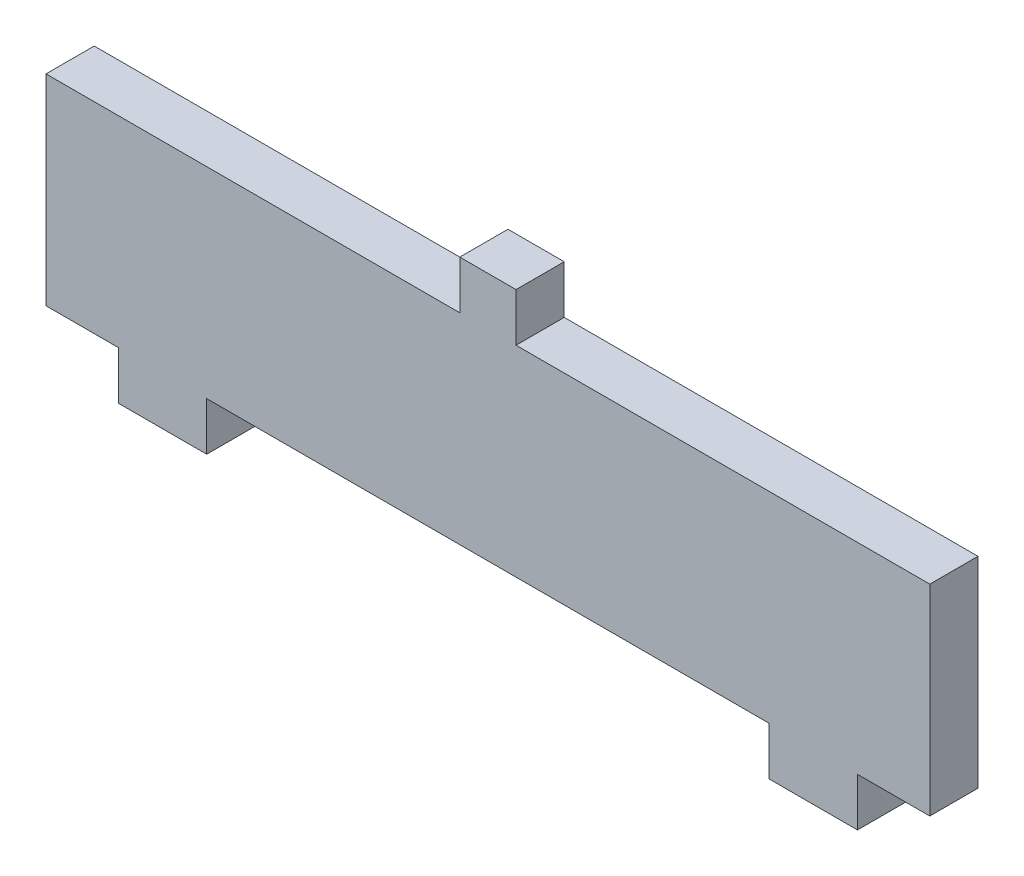
ISO-10303-21;
HEADER;
FILE_DESCRIPTION(('STEP AP214'),'2;1');
FILE_NAME('part.step','',(''),(''),'','','');
FILE_SCHEMA(('AUTOMOTIVE_DESIGN { 1 0 10303 214 1 1 1 1 }'));
ENDSEC;
DATA;
#1=APPLICATION_CONTEXT('core data for automotive mechanical design processes');
#2=APPLICATION_PROTOCOL_DEFINITION('international standard','automotive_design',2000,#1);
#3=PRODUCT_CONTEXT('',#1,'mechanical');
#4=PRODUCT('Part','Part','',(#3));
#5=PRODUCT_RELATED_PRODUCT_CATEGORY('part','',(#4));
#6=PRODUCT_DEFINITION_FORMATION('','',#4);
#7=PRODUCT_DEFINITION_CONTEXT('part definition',#1,'design');
#8=PRODUCT_DEFINITION('design','',#6,#7);
#9=PRODUCT_DEFINITION_SHAPE('','',#8);
#10=(LENGTH_UNIT() NAMED_UNIT(*) SI_UNIT(.MILLI.,.METRE.));
#11=(NAMED_UNIT(*) PLANE_ANGLE_UNIT() SI_UNIT($,.RADIAN.));
#12=(NAMED_UNIT(*) SI_UNIT($,.STERADIAN.) SOLID_ANGLE_UNIT());
#13=UNCERTAINTY_MEASURE_WITH_UNIT(LENGTH_MEASURE(1.E-05),#10,'distance_accuracy_value','');
#14=(GEOMETRIC_REPRESENTATION_CONTEXT(3) GLOBAL_UNCERTAINTY_ASSIGNED_CONTEXT((#13)) GLOBAL_UNIT_ASSIGNED_CONTEXT((#10,
#11,#12)) REPRESENTATION_CONTEXT('',''));
#15=CARTESIAN_POINT('',(0.,0.,0.));
#16=DIRECTION('',(0.,0.,1.));
#17=DIRECTION('',(1.,0.,0.));
#18=AXIS2_PLACEMENT_3D('',#15,#16,#17);
#19=CARTESIAN_POINT('',(27.5,-6.25,3.));
#20=DIRECTION('',(-1.,0.,0.));
#21=DIRECTION('',(0.,0.,1.));
#22=AXIS2_PLACEMENT_3D('',#19,#20,#21);
#23=PLANE('',#22);
#24=DIRECTION('',(0.,1.,0.));
#25=VECTOR('',#24,1.);
#26=CARTESIAN_POINT('',(27.5,-6.25,0.));
#27=LINE('',#26,#25);
#28=CARTESIAN_POINT('',(27.5,-6.25,0.));
#29=VERTEX_POINT('',#28);
#30=CARTESIAN_POINT('',(27.5,6.25,0.));
#31=VERTEX_POINT('',#30);
#32=EDGE_CURVE('E177',#29,#31,#27,.T.);
#33=ORIENTED_EDGE('',*,*,#32,.T.);
#34=DIRECTION('',(0.,0.,-1.));
#35=VECTOR('',#34,1.);
#36=CARTESIAN_POINT('',(27.5,6.25,3.));
#37=LINE('',#36,#35);
#38=CARTESIAN_POINT('',(27.5,6.25,3.));
#39=VERTEX_POINT('',#38);
#40=EDGE_CURVE('E11',#39,#31,#37,.T.);
#41=ORIENTED_EDGE('',*,*,#40,.F.);
#42=DIRECTION('',(0.,1.,0.));
#43=VECTOR('',#42,1.);
#44=CARTESIAN_POINT('',(27.5,-6.25,3.));
#45=LINE('',#44,#43);
#46=CARTESIAN_POINT('',(27.5,-6.25,3.));
#47=VERTEX_POINT('',#46);
#48=EDGE_CURVE('E207',#47,#39,#45,.T.);
#49=ORIENTED_EDGE('',*,*,#48,.F.);
#50=DIRECTION('',(0.,0.,-1.));
#51=VECTOR('',#50,1.);
#52=CARTESIAN_POINT('',(27.5,-6.25,3.));
#53=LINE('',#52,#51);
#54=EDGE_CURVE('E173',#47,#29,#53,.T.);
#55=ORIENTED_EDGE('',*,*,#54,.T.);
#56=EDGE_LOOP('',(#33,#41,#49,#55));
#57=FACE_BOUND('',#56,.T.);
#58=ADVANCED_FACE('F33',(#57),#23,.F.);
#59=CARTESIAN_POINT('',(1.75,6.25000000000001,3.));
#60=DIRECTION('',(0.,-1.,0.));
#61=DIRECTION('',(1.,0.,0.));
#62=AXIS2_PLACEMENT_3D('',#59,#60,#61);
#63=PLANE('',#62);
#64=DIRECTION('',(-1.,0.,0.));
#65=VECTOR('',#64,1.);
#66=CARTESIAN_POINT('',(1.75,6.25000000000001,0.));
#67=LINE('',#66,#65);
#68=CARTESIAN_POINT('',(1.75,6.25000000000001,0.));
#69=VERTEX_POINT('',#68);
#70=EDGE_CURVE('E180',#31,#69,#67,.T.);
#71=ORIENTED_EDGE('',*,*,#70,.T.);
#72=DIRECTION('',(0.,0.,-1.));
#73=VECTOR('',#72,1.);
#74=CARTESIAN_POINT('',(1.75,6.25000000000001,3.));
#75=LINE('',#74,#73);
#76=CARTESIAN_POINT('',(1.75,6.25000000000001,3.));
#77=VERTEX_POINT('',#76);
#78=EDGE_CURVE('E41',#77,#69,#75,.T.);
#79=ORIENTED_EDGE('',*,*,#78,.F.);
#80=DIRECTION('',(-1.,0.,0.));
#81=VECTOR('',#80,1.);
#82=CARTESIAN_POINT('',(1.75,6.25000000000001,3.));
#83=LINE('',#82,#81);
#84=EDGE_CURVE('E116',#39,#77,#83,.T.);
#85=ORIENTED_EDGE('',*,*,#84,.F.);
#86=ORIENTED_EDGE('',*,*,#40,.T.);
#87=EDGE_LOOP('',(#71,#79,#85,#86));
#88=FACE_BOUND('',#87,.T.);
#89=ADVANCED_FACE('F305',(#88),#63,.F.);
#90=CARTESIAN_POINT('',(1.75,6.25000000000001,3.));
#91=DIRECTION('',(-1.,0.,0.));
#92=DIRECTION('',(0.,-1.,0.));
#93=AXIS2_PLACEMENT_3D('',#90,#91,#92);
#94=PLANE('',#93);
#95=DIRECTION('',(0.,1.,0.));
#96=VECTOR('',#95,1.);
#97=CARTESIAN_POINT('',(1.75,6.25000000000001,0.));
#98=LINE('',#97,#96);
#99=CARTESIAN_POINT('',(1.75,9.25000000000001,0.));
#100=VERTEX_POINT('',#99);
#101=EDGE_CURVE('E182',#69,#100,#98,.T.);
#102=ORIENTED_EDGE('',*,*,#101,.T.);
#103=DIRECTION('',(0.,0.,-1.));
#104=VECTOR('',#103,1.);
#105=CARTESIAN_POINT('',(1.75,9.25000000000001,3.));
#106=LINE('',#105,#104);
#107=CARTESIAN_POINT('',(1.75,9.25000000000001,3.));
#108=VERTEX_POINT('',#107);
#109=EDGE_CURVE('E238',#108,#100,#106,.T.);
#110=ORIENTED_EDGE('',*,*,#109,.F.);
#111=DIRECTION('',(0.,1.,0.));
#112=VECTOR('',#111,1.);
#113=CARTESIAN_POINT('',(1.75,6.25000000000001,3.));
#114=LINE('',#113,#112);
#115=EDGE_CURVE('E246',#77,#108,#114,.T.);
#116=ORIENTED_EDGE('',*,*,#115,.F.);
#117=ORIENTED_EDGE('',*,*,#78,.T.);
#118=EDGE_LOOP('',(#102,#110,#116,#117));
#119=FACE_BOUND('',#118,.T.);
#120=ADVANCED_FACE('F244',(#119),#94,.F.);
#121=CARTESIAN_POINT('',(-1.75,9.25000000000001,3.));
#122=DIRECTION('',(0.,-1.,0.));
#123=DIRECTION('',(0.,0.,-1.));
#124=AXIS2_PLACEMENT_3D('',#121,#122,#123);
#125=PLANE('',#124);
#126=DIRECTION('',(-1.,0.,0.));
#127=VECTOR('',#126,1.);
#128=CARTESIAN_POINT('',(-1.75,9.25000000000001,0.));
#129=LINE('',#128,#127);
#130=CARTESIAN_POINT('',(-1.75,9.25000000000001,0.));
#131=VERTEX_POINT('',#130);
#132=EDGE_CURVE('E184',#100,#131,#129,.T.);
#133=ORIENTED_EDGE('',*,*,#132,.T.);
#134=DIRECTION('',(0.,0.,-1.));
#135=VECTOR('',#134,1.);
#136=CARTESIAN_POINT('',(-1.75,9.25000000000001,3.));
#137=LINE('',#136,#135);
#138=CARTESIAN_POINT('',(-1.75,9.25000000000001,3.));
#139=VERTEX_POINT('',#138);
#140=EDGE_CURVE('E235',#139,#131,#137,.T.);
#141=ORIENTED_EDGE('',*,*,#140,.F.);
#142=DIRECTION('',(-1.,0.,0.));
#143=VECTOR('',#142,1.);
#144=CARTESIAN_POINT('',(-1.75,9.25000000000001,3.));
#145=LINE('',#144,#143);
#146=EDGE_CURVE('E264',#108,#139,#145,.T.);
#147=ORIENTED_EDGE('',*,*,#146,.F.);
#148=ORIENTED_EDGE('',*,*,#109,.T.);
#149=EDGE_LOOP('',(#133,#141,#147,#148));
#150=FACE_BOUND('',#149,.T.);
#151=ADVANCED_FACE('F255',(#150),#125,.F.);
#152=CARTESIAN_POINT('',(-1.75,6.25000000000001,3.));
#153=DIRECTION('',(1.,0.,0.));
#154=DIRECTION('',(0.,1.,0.));
#155=AXIS2_PLACEMENT_3D('',#152,#153,#154);
#156=PLANE('',#155);
#157=DIRECTION('',(0.,-1.,0.));
#158=VECTOR('',#157,1.);
#159=CARTESIAN_POINT('',(-1.75,6.25000000000001,0.));
#160=LINE('',#159,#158);
#161=CARTESIAN_POINT('',(-1.75,6.25000000000001,0.));
#162=VERTEX_POINT('',#161);
#163=EDGE_CURVE('E186',#131,#162,#160,.T.);
#164=ORIENTED_EDGE('',*,*,#163,.T.);
#165=DIRECTION('',(0.,0.,-1.));
#166=VECTOR('',#165,1.);
#167=CARTESIAN_POINT('',(-1.75,6.25000000000001,3.));
#168=LINE('',#167,#166);
#169=CARTESIAN_POINT('',(-1.75,6.25000000000001,3.));
#170=VERTEX_POINT('',#169);
#171=EDGE_CURVE('E232',#170,#162,#168,.T.);
#172=ORIENTED_EDGE('',*,*,#171,.F.);
#173=DIRECTION('',(0.,-1.,0.));
#174=VECTOR('',#173,1.);
#175=CARTESIAN_POINT('',(-1.75,6.25000000000001,3.));
#176=LINE('',#175,#174);
#177=EDGE_CURVE('E261',#139,#170,#176,.T.);
#178=ORIENTED_EDGE('',*,*,#177,.F.);
#179=ORIENTED_EDGE('',*,*,#140,.T.);
#180=EDGE_LOOP('',(#164,#172,#178,#179));
#181=FACE_BOUND('',#180,.T.);
#182=ADVANCED_FACE('F259',(#181),#156,.F.);
#183=CARTESIAN_POINT('',(-27.5,6.25,3.));
#184=DIRECTION('',(0.,-1.,0.));
#185=DIRECTION('',(1.,0.,0.));
#186=AXIS2_PLACEMENT_3D('',#183,#184,#185);
#187=PLANE('',#186);
#188=DIRECTION('',(-1.,0.,0.));
#189=VECTOR('',#188,1.);
#190=CARTESIAN_POINT('',(-27.5,6.25,0.));
#191=LINE('',#190,#189);
#192=CARTESIAN_POINT('',(-27.5,6.25,0.));
#193=VERTEX_POINT('',#192);
#194=EDGE_CURVE('E188',#162,#193,#191,.T.);
#195=ORIENTED_EDGE('',*,*,#194,.T.);
#196=DIRECTION('',(0.,0.,-1.));
#197=VECTOR('',#196,1.);
#198=CARTESIAN_POINT('',(-27.5,6.25,3.));
#199=LINE('',#198,#197);
#200=CARTESIAN_POINT('',(-27.5,6.25,3.));
#201=VERTEX_POINT('',#200);
#202=EDGE_CURVE('E229',#201,#193,#199,.T.);
#203=ORIENTED_EDGE('',*,*,#202,.F.);
#204=DIRECTION('',(-1.,0.,0.));
#205=VECTOR('',#204,1.);
#206=CARTESIAN_POINT('',(-27.5,6.25,3.));
#207=LINE('',#206,#205);
#208=EDGE_CURVE('E263',#170,#201,#207,.T.);
#209=ORIENTED_EDGE('',*,*,#208,.F.);
#210=ORIENTED_EDGE('',*,*,#171,.T.);
#211=EDGE_LOOP('',(#195,#203,#209,#210));
#212=FACE_BOUND('',#211,.T.);
#213=ADVANCED_FACE('F318',(#212),#187,.F.);
#214=CARTESIAN_POINT('',(-27.5,-6.25,3.));
#215=DIRECTION('',(1.,0.,0.));
#216=DIRECTION('',(0.,0.,-1.));
#217=AXIS2_PLACEMENT_3D('',#214,#215,#216);
#218=PLANE('',#217);
#219=DIRECTION('',(0.,-1.,0.));
#220=VECTOR('',#219,1.);
#221=CARTESIAN_POINT('',(-27.5,-6.25,0.));
#222=LINE('',#221,#220);
#223=CARTESIAN_POINT('',(-27.5,-6.25,0.));
#224=VERTEX_POINT('',#223);
#225=EDGE_CURVE('E190',#193,#224,#222,.T.);
#226=ORIENTED_EDGE('',*,*,#225,.T.);
#227=DIRECTION('',(0.,0.,-1.));
#228=VECTOR('',#227,1.);
#229=CARTESIAN_POINT('',(-27.5,-6.25,3.));
#230=LINE('',#229,#228);
#231=CARTESIAN_POINT('',(-27.5,-6.25,3.));
#232=VERTEX_POINT('',#231);
#233=EDGE_CURVE('E226',#232,#224,#230,.T.);
#234=ORIENTED_EDGE('',*,*,#233,.F.);
#235=DIRECTION('',(0.,-1.,0.));
#236=VECTOR('',#235,1.);
#237=CARTESIAN_POINT('',(-27.5,-6.25,3.));
#238=LINE('',#237,#236);
#239=EDGE_CURVE('E266',#201,#232,#238,.T.);
#240=ORIENTED_EDGE('',*,*,#239,.F.);
#241=ORIENTED_EDGE('',*,*,#202,.T.);
#242=EDGE_LOOP('',(#226,#234,#240,#241));
#243=FACE_BOUND('',#242,.T.);
#244=ADVANCED_FACE('F321',(#243),#218,.F.);
#245=CARTESIAN_POINT('',(-27.5,-6.25,3.));
#246=DIRECTION('',(0.,1.,0.));
#247=DIRECTION('',(0.,0.,1.));
#248=AXIS2_PLACEMENT_3D('',#245,#246,#247);
#249=PLANE('',#248);
#250=DIRECTION('',(1.,0.,0.));
#251=VECTOR('',#250,1.);
#252=CARTESIAN_POINT('',(-27.5,-6.25,0.));
#253=LINE('',#252,#251);
#254=CARTESIAN_POINT('',(-23.,-6.25,0.));
#255=VERTEX_POINT('',#254);
#256=EDGE_CURVE('E192',#224,#255,#253,.T.);
#257=ORIENTED_EDGE('',*,*,#256,.T.);
#258=DIRECTION('',(0.,0.,-1.));
#259=VECTOR('',#258,1.);
#260=CARTESIAN_POINT('',(-23.,-6.25,3.));
#261=LINE('',#260,#259);
#262=CARTESIAN_POINT('',(-23.,-6.25,3.));
#263=VERTEX_POINT('',#262);
#264=EDGE_CURVE('E223',#263,#255,#261,.T.);
#265=ORIENTED_EDGE('',*,*,#264,.F.);
#266=DIRECTION('',(1.,0.,0.));
#267=VECTOR('',#266,1.);
#268=CARTESIAN_POINT('',(-27.5,-6.25,3.));
#269=LINE('',#268,#267);
#270=EDGE_CURVE('E272',#232,#263,#269,.T.);
#271=ORIENTED_EDGE('',*,*,#270,.F.);
#272=ORIENTED_EDGE('',*,*,#233,.T.);
#273=EDGE_LOOP('',(#257,#265,#271,#272));
#274=FACE_BOUND('',#273,.T.);
#275=ADVANCED_FACE('F325',(#274),#249,.F.);
#276=CARTESIAN_POINT('',(-23.,-6.25,3.));
#277=DIRECTION('',(1.,0.,0.));
#278=DIRECTION('',(0.,1.,0.));
#279=AXIS2_PLACEMENT_3D('',#276,#277,#278);
#280=PLANE('',#279);
#281=DIRECTION('',(0.,-1.,0.));
#282=VECTOR('',#281,1.);
#283=CARTESIAN_POINT('',(-23.,-6.25,0.));
#284=LINE('',#283,#282);
#285=CARTESIAN_POINT('',(-23.,-9.25,0.));
#286=VERTEX_POINT('',#285);
#287=EDGE_CURVE('E194',#255,#286,#284,.T.);
#288=ORIENTED_EDGE('',*,*,#287,.T.);
#289=DIRECTION('',(0.,0.,-1.));
#290=VECTOR('',#289,1.);
#291=CARTESIAN_POINT('',(-23.,-9.25,3.));
#292=LINE('',#291,#290);
#293=CARTESIAN_POINT('',(-23.,-9.25,3.));
#294=VERTEX_POINT('',#293);
#295=EDGE_CURVE('E220',#294,#286,#292,.T.);
#296=ORIENTED_EDGE('',*,*,#295,.F.);
#297=DIRECTION('',(0.,-1.,0.));
#298=VECTOR('',#297,1.);
#299=CARTESIAN_POINT('',(-23.,-6.25,3.));
#300=LINE('',#299,#298);
#301=EDGE_CURVE('E274',#263,#294,#300,.T.);
#302=ORIENTED_EDGE('',*,*,#301,.F.);
#303=ORIENTED_EDGE('',*,*,#264,.T.);
#304=EDGE_LOOP('',(#288,#296,#302,#303));
#305=FACE_BOUND('',#304,.T.);
#306=ADVANCED_FACE('F329',(#305),#280,.F.);
#307=CARTESIAN_POINT('',(-23.,-9.25,3.));
#308=DIRECTION('',(0.,1.,0.));
#309=DIRECTION('',(0.,0.,1.));
#310=AXIS2_PLACEMENT_3D('',#307,#308,#309);
#311=PLANE('',#310);
#312=DIRECTION('',(1.,0.,0.));
#313=VECTOR('',#312,1.);
#314=CARTESIAN_POINT('',(-23.,-9.25,0.));
#315=LINE('',#314,#313);
#316=CARTESIAN_POINT('',(-17.5,-9.25,0.));
#317=VERTEX_POINT('',#316);
#318=EDGE_CURVE('E196',#286,#317,#315,.T.);
#319=ORIENTED_EDGE('',*,*,#318,.T.);
#320=DIRECTION('',(0.,0.,-1.));
#321=VECTOR('',#320,1.);
#322=CARTESIAN_POINT('',(-17.5,-9.25,3.));
#323=LINE('',#322,#321);
#324=CARTESIAN_POINT('',(-17.5,-9.25,3.));
#325=VERTEX_POINT('',#324);
#326=EDGE_CURVE('E217',#325,#317,#323,.T.);
#327=ORIENTED_EDGE('',*,*,#326,.F.);
#328=DIRECTION('',(1.,0.,0.));
#329=VECTOR('',#328,1.);
#330=CARTESIAN_POINT('',(-23.,-9.25,3.));
#331=LINE('',#330,#329);
#332=EDGE_CURVE('E276',#294,#325,#331,.T.);
#333=ORIENTED_EDGE('',*,*,#332,.F.);
#334=ORIENTED_EDGE('',*,*,#295,.T.);
#335=EDGE_LOOP('',(#319,#327,#333,#334));
#336=FACE_BOUND('',#335,.T.);
#337=ADVANCED_FACE('F333',(#336),#311,.F.);
#338=CARTESIAN_POINT('',(-17.5,-6.25,3.));
#339=DIRECTION('',(-1.,0.,0.));
#340=DIRECTION('',(0.,0.,1.));
#341=AXIS2_PLACEMENT_3D('',#338,#339,#340);
#342=PLANE('',#341);
#343=DIRECTION('',(0.,1.,0.));
#344=VECTOR('',#343,1.);
#345=CARTESIAN_POINT('',(-17.5,-6.25,0.));
#346=LINE('',#345,#344);
#347=CARTESIAN_POINT('',(-17.5,-6.25,0.));
#348=VERTEX_POINT('',#347);
#349=EDGE_CURVE('E198',#317,#348,#346,.T.);
#350=ORIENTED_EDGE('',*,*,#349,.T.);
#351=DIRECTION('',(0.,0.,-1.));
#352=VECTOR('',#351,1.);
#353=CARTESIAN_POINT('',(-17.5,-6.25,3.));
#354=LINE('',#353,#352);
#355=CARTESIAN_POINT('',(-17.5,-6.25,3.));
#356=VERTEX_POINT('',#355);
#357=EDGE_CURVE('E214',#356,#348,#354,.T.);
#358=ORIENTED_EDGE('',*,*,#357,.F.);
#359=DIRECTION('',(0.,1.,0.));
#360=VECTOR('',#359,1.);
#361=CARTESIAN_POINT('',(-17.5,-6.25,3.));
#362=LINE('',#361,#360);
#363=EDGE_CURVE('E278',#325,#356,#362,.T.);
#364=ORIENTED_EDGE('',*,*,#363,.F.);
#365=ORIENTED_EDGE('',*,*,#326,.T.);
#366=EDGE_LOOP('',(#350,#358,#364,#365));
#367=FACE_BOUND('',#366,.T.);
#368=ADVANCED_FACE('F337',(#367),#342,.F.);
#369=CARTESIAN_POINT('',(-17.5,-6.25,3.));
#370=DIRECTION('',(0.,1.,0.));
#371=DIRECTION('',(0.,0.,1.));
#372=AXIS2_PLACEMENT_3D('',#369,#370,#371);
#373=PLANE('',#372);
#374=DIRECTION('',(1.,0.,0.));
#375=VECTOR('',#374,1.);
#376=CARTESIAN_POINT('',(-17.5,-6.25,0.));
#377=LINE('',#376,#375);
#378=CARTESIAN_POINT('',(17.5,-6.25,0.));
#379=VERTEX_POINT('',#378);
#380=EDGE_CURVE('E200',#348,#379,#377,.T.);
#381=ORIENTED_EDGE('',*,*,#380,.T.);
#382=DIRECTION('',(0.,0.,-1.));
#383=VECTOR('',#382,1.);
#384=CARTESIAN_POINT('',(17.5,-6.25,3.));
#385=LINE('',#384,#383);
#386=CARTESIAN_POINT('',(17.5,-6.25,3.));
#387=VERTEX_POINT('',#386);
#388=EDGE_CURVE('E211',#387,#379,#385,.T.);
#389=ORIENTED_EDGE('',*,*,#388,.F.);
#390=DIRECTION('',(1.,0.,0.));
#391=VECTOR('',#390,1.);
#392=CARTESIAN_POINT('',(-17.5,-6.25,3.));
#393=LINE('',#392,#391);
#394=EDGE_CURVE('E280',#356,#387,#393,.T.);
#395=ORIENTED_EDGE('',*,*,#394,.F.);
#396=ORIENTED_EDGE('',*,*,#357,.T.);
#397=EDGE_LOOP('',(#381,#389,#395,#396));
#398=FACE_BOUND('',#397,.T.);
#399=ADVANCED_FACE('F286',(#398),#373,.F.);
#400=CARTESIAN_POINT('',(17.5,-6.25,3.));
#401=DIRECTION('',(1.,0.,0.));
#402=DIRECTION('',(0.,0.,-1.));
#403=AXIS2_PLACEMENT_3D('',#400,#401,#402);
#404=PLANE('',#403);
#405=DIRECTION('',(0.,-1.,0.));
#406=VECTOR('',#405,1.);
#407=CARTESIAN_POINT('',(17.5,-6.25,0.));
#408=LINE('',#407,#406);
#409=CARTESIAN_POINT('',(17.5,-9.25,0.));
#410=VERTEX_POINT('',#409);
#411=EDGE_CURVE('E202',#379,#410,#408,.T.);
#412=ORIENTED_EDGE('',*,*,#411,.T.);
#413=DIRECTION('',(0.,0.,-1.));
#414=VECTOR('',#413,1.);
#415=CARTESIAN_POINT('',(17.5,-9.25,3.));
#416=LINE('',#415,#414);
#417=CARTESIAN_POINT('',(17.5,-9.25,3.));
#418=VERTEX_POINT('',#417);
#419=EDGE_CURVE('E168',#418,#410,#416,.T.);
#420=ORIENTED_EDGE('',*,*,#419,.F.);
#421=DIRECTION('',(0.,-1.,0.));
#422=VECTOR('',#421,1.);
#423=CARTESIAN_POINT('',(17.5,-6.25,3.));
#424=LINE('',#423,#422);
#425=EDGE_CURVE('E159',#387,#418,#424,.T.);
#426=ORIENTED_EDGE('',*,*,#425,.F.);
#427=ORIENTED_EDGE('',*,*,#388,.T.);
#428=EDGE_LOOP('',(#412,#420,#426,#427));
#429=FACE_BOUND('',#428,.T.);
#430=ADVANCED_FACE('F290',(#429),#404,.F.);
#431=CARTESIAN_POINT('',(17.5,-9.25,3.));
#432=DIRECTION('',(0.,1.,0.));
#433=DIRECTION('',(-1.,0.,0.));
#434=AXIS2_PLACEMENT_3D('',#431,#432,#433);
#435=PLANE('',#434);
#436=DIRECTION('',(1.,0.,0.));
#437=VECTOR('',#436,1.);
#438=CARTESIAN_POINT('',(17.5,-9.25,0.));
#439=LINE('',#438,#437);
#440=CARTESIAN_POINT('',(23.,-9.25,0.));
#441=VERTEX_POINT('',#440);
#442=EDGE_CURVE('E167',#410,#441,#439,.T.);
#443=ORIENTED_EDGE('',*,*,#442,.T.);
#444=DIRECTION('',(0.,0.,-1.));
#445=VECTOR('',#444,1.);
#446=CARTESIAN_POINT('',(23.,-9.25,3.));
#447=LINE('',#446,#445);
#448=CARTESIAN_POINT('',(23.,-9.25,3.));
#449=VERTEX_POINT('',#448);
#450=EDGE_CURVE('E164',#449,#441,#447,.T.);
#451=ORIENTED_EDGE('',*,*,#450,.F.);
#452=DIRECTION('',(1.,0.,0.));
#453=VECTOR('',#452,1.);
#454=CARTESIAN_POINT('',(17.5,-9.25,3.));
#455=LINE('',#454,#453);
#456=EDGE_CURVE('E153',#418,#449,#455,.T.);
#457=ORIENTED_EDGE('',*,*,#456,.F.);
#458=ORIENTED_EDGE('',*,*,#419,.T.);
#459=EDGE_LOOP('',(#443,#451,#457,#458));
#460=FACE_BOUND('',#459,.T.);
#461=ADVANCED_FACE('F165',(#460),#435,.F.);
#462=CARTESIAN_POINT('',(23.,-6.25,3.));
#463=DIRECTION('',(-1.,0.,0.));
#464=DIRECTION('',(0.,0.,1.));
#465=AXIS2_PLACEMENT_3D('',#462,#463,#464);
#466=PLANE('',#465);
#467=DIRECTION('',(0.,1.,0.));
#468=VECTOR('',#467,1.);
#469=CARTESIAN_POINT('',(23.,-6.25,0.));
#470=LINE('',#469,#468);
#471=CARTESIAN_POINT('',(23.,-6.25,0.));
#472=VERTEX_POINT('',#471);
#473=EDGE_CURVE('E102',#441,#472,#470,.T.);
#474=ORIENTED_EDGE('',*,*,#473,.T.);
#475=DIRECTION('',(0.,0.,-1.));
#476=VECTOR('',#475,1.);
#477=CARTESIAN_POINT('',(23.,-6.25,3.));
#478=LINE('',#477,#476);
#479=CARTESIAN_POINT('',(23.,-6.25,3.));
#480=VERTEX_POINT('',#479);
#481=EDGE_CURVE('E169',#480,#472,#478,.T.);
#482=ORIENTED_EDGE('',*,*,#481,.F.);
#483=DIRECTION('',(0.,1.,0.));
#484=VECTOR('',#483,1.);
#485=CARTESIAN_POINT('',(23.,-6.25,3.));
#486=LINE('',#485,#484);
#487=EDGE_CURVE('E157',#449,#480,#486,.T.);
#488=ORIENTED_EDGE('',*,*,#487,.F.);
#489=ORIENTED_EDGE('',*,*,#450,.T.);
#490=EDGE_LOOP('',(#474,#482,#488,#489));
#491=FACE_BOUND('',#490,.T.);
#492=ADVANCED_FACE('F171',(#491),#466,.F.);
#493=CARTESIAN_POINT('',(23.,-6.25,3.));
#494=DIRECTION('',(0.,1.,0.));
#495=DIRECTION('',(0.,0.,1.));
#496=AXIS2_PLACEMENT_3D('',#493,#494,#495);
#497=PLANE('',#496);
#498=DIRECTION('',(1.,0.,0.));
#499=VECTOR('',#498,1.);
#500=CARTESIAN_POINT('',(23.,-6.25,0.));
#501=LINE('',#500,#499);
#502=EDGE_CURVE('E108',#472,#29,#501,.T.);
#503=ORIENTED_EDGE('',*,*,#502,.T.);
#504=ORIENTED_EDGE('',*,*,#54,.F.);
#505=DIRECTION('',(1.,0.,0.));
#506=VECTOR('',#505,1.);
#507=CARTESIAN_POINT('',(23.,-6.25,3.));
#508=LINE('',#507,#506);
#509=EDGE_CURVE('E49',#480,#47,#508,.T.);
#510=ORIENTED_EDGE('',*,*,#509,.F.);
#511=ORIENTED_EDGE('',*,*,#481,.T.);
#512=EDGE_LOOP('',(#503,#504,#510,#511));
#513=FACE_BOUND('',#512,.T.);
#514=ADVANCED_FACE('F294',(#513),#497,.F.);
#515=CARTESIAN_POINT('',(0.,0.,3.));
#516=DIRECTION('',(0.,0.,-1.));
#517=DIRECTION('',(-1.,0.,0.));
#518=AXIS2_PLACEMENT_3D('',#515,#516,#517);
#519=PLANE('',#518);
#520=ORIENTED_EDGE('',*,*,#48,.T.);
#521=ORIENTED_EDGE('',*,*,#84,.T.);
#522=ORIENTED_EDGE('',*,*,#115,.T.);
#523=ORIENTED_EDGE('',*,*,#146,.T.);
#524=ORIENTED_EDGE('',*,*,#177,.T.);
#525=ORIENTED_EDGE('',*,*,#208,.T.);
#526=ORIENTED_EDGE('',*,*,#239,.T.);
#527=ORIENTED_EDGE('',*,*,#270,.T.);
#528=ORIENTED_EDGE('',*,*,#301,.T.);
#529=ORIENTED_EDGE('',*,*,#332,.T.);
#530=ORIENTED_EDGE('',*,*,#363,.T.);
#531=ORIENTED_EDGE('',*,*,#394,.T.);
#532=ORIENTED_EDGE('',*,*,#425,.T.);
#533=ORIENTED_EDGE('',*,*,#456,.T.);
#534=ORIENTED_EDGE('',*,*,#487,.T.);
#535=ORIENTED_EDGE('',*,*,#509,.T.);
#536=EDGE_LOOP('',(#520,#521,#522,#523,#524,#525,#526,#527,#528,#529,#530,#531,#532,#533,#534,#535));
#537=FACE_BOUND('',#536,.T.);
#538=ADVANCED_FACE('F155',(#537),#519,.F.);
#539=CARTESIAN_POINT('',(0.,0.,0.));
#540=DIRECTION('',(0.,0.,-1.));
#541=DIRECTION('',(-1.,0.,0.));
#542=AXIS2_PLACEMENT_3D('',#539,#540,#541);
#543=PLANE('',#542);
#544=ORIENTED_EDGE('',*,*,#32,.F.);
#545=ORIENTED_EDGE('',*,*,#502,.F.);
#546=ORIENTED_EDGE('',*,*,#473,.F.);
#547=ORIENTED_EDGE('',*,*,#442,.F.);
#548=ORIENTED_EDGE('',*,*,#411,.F.);
#549=ORIENTED_EDGE('',*,*,#380,.F.);
#550=ORIENTED_EDGE('',*,*,#349,.F.);
#551=ORIENTED_EDGE('',*,*,#318,.F.);
#552=ORIENTED_EDGE('',*,*,#287,.F.);
#553=ORIENTED_EDGE('',*,*,#256,.F.);
#554=ORIENTED_EDGE('',*,*,#225,.F.);
#555=ORIENTED_EDGE('',*,*,#194,.F.);
#556=ORIENTED_EDGE('',*,*,#163,.F.);
#557=ORIENTED_EDGE('',*,*,#132,.F.);
#558=ORIENTED_EDGE('',*,*,#101,.F.);
#559=ORIENTED_EDGE('',*,*,#70,.F.);
#560=EDGE_LOOP('',(#544,#545,#546,#547,#548,#549,#550,#551,#552,#553,#554,#555,#556,#557,#558,#559));
#561=FACE_BOUND('',#560,.T.);
#562=ADVANCED_FACE('F250',(#561),#543,.T.);
#563=CLOSED_SHELL('',(#58,#89,#120,#151,#182,#213,#244,#275,#306,#337,#368,#399,#430,#461,#492,
#514,#538,#562));
#564=MANIFOLD_SOLID_BREP('B2',#563);
#565=ADVANCED_BREP_SHAPE_REPRESENTATION('',(#18,#564),#14);
#566=SHAPE_DEFINITION_REPRESENTATION(#9,#565);
ENDSEC;
END-ISO-10303-21;
